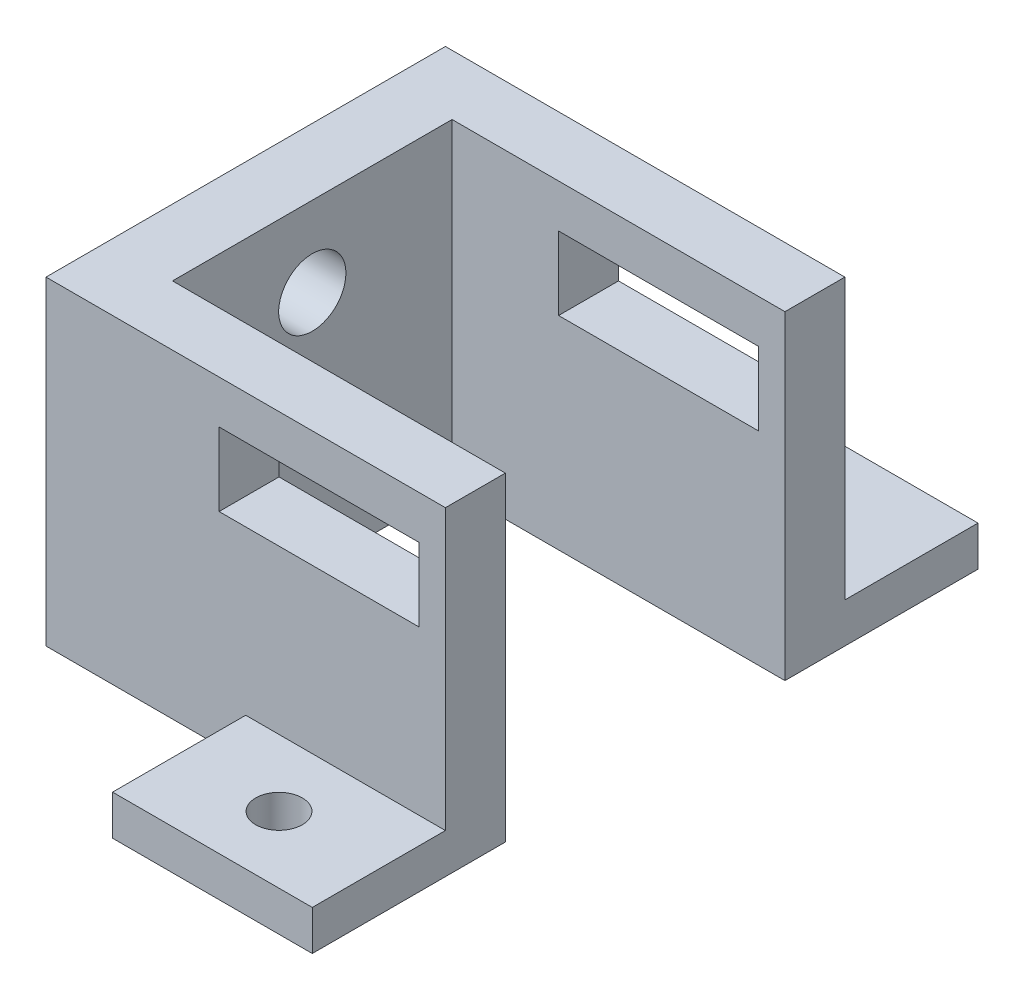
ISO-10303-21;
HEADER;
FILE_DESCRIPTION(('STEP AP214'),'2;1');
FILE_NAME('part.step','',(''),(''),'','','');
FILE_SCHEMA(('AUTOMOTIVE_DESIGN { 1 0 10303 214 1 1 1 1 }'));
ENDSEC;
DATA;
#1=APPLICATION_CONTEXT('core data for automotive mechanical design processes');
#2=APPLICATION_PROTOCOL_DEFINITION('international standard','automotive_design',2000,#1);
#3=PRODUCT_CONTEXT('',#1,'mechanical');
#4=PRODUCT('Part','Part','',(#3));
#5=PRODUCT_RELATED_PRODUCT_CATEGORY('part','',(#4));
#6=PRODUCT_DEFINITION_FORMATION('','',#4);
#7=PRODUCT_DEFINITION_CONTEXT('part definition',#1,'design');
#8=PRODUCT_DEFINITION('design','',#6,#7);
#9=PRODUCT_DEFINITION_SHAPE('','',#8);
#10=(LENGTH_UNIT() NAMED_UNIT(*) SI_UNIT(.MILLI.,.METRE.));
#11=(NAMED_UNIT(*) PLANE_ANGLE_UNIT() SI_UNIT($,.RADIAN.));
#12=(NAMED_UNIT(*) SI_UNIT($,.STERADIAN.) SOLID_ANGLE_UNIT());
#13=UNCERTAINTY_MEASURE_WITH_UNIT(LENGTH_MEASURE(1.E-05),#10,'distance_accuracy_value','');
#14=(GEOMETRIC_REPRESENTATION_CONTEXT(3) GLOBAL_UNCERTAINTY_ASSIGNED_CONTEXT((#13)) GLOBAL_UNIT_ASSIGNED_CONTEXT((#10,
#11,#12)) REPRESENTATION_CONTEXT('',''));
#15=CARTESIAN_POINT('',(0.,0.,0.));
#16=DIRECTION('',(0.,0.,1.));
#17=DIRECTION('',(1.,0.,0.));
#18=AXIS2_PLACEMENT_3D('',#15,#16,#17);
#19=CARTESIAN_POINT('',(0.,0.,30.));
#20=DIRECTION('',(0.,0.,-1.));
#21=DIRECTION('',(-1.,0.,0.));
#22=AXIS2_PLACEMENT_3D('',#19,#20,#21);
#23=PLANE('',#22);
#24=DIRECTION('',(0.,-1.,0.));
#25=VECTOR('',#24,1.);
#26=CARTESIAN_POINT('',(-2.,3.24999999999999,30.));
#27=LINE('',#26,#25);
#28=CARTESIAN_POINT('',(-2.,8.75,30.));
#29=VERTEX_POINT('',#28);
#30=CARTESIAN_POINT('',(-2.,3.24999999999999,30.));
#31=VERTEX_POINT('',#30);
#32=EDGE_CURVE('E303',#29,#31,#27,.T.);
#33=ORIENTED_EDGE('',*,*,#32,.F.);
#34=DIRECTION('',(-1.,0.,0.));
#35=VECTOR('',#34,1.);
#36=CARTESIAN_POINT('',(13.,8.74999999999999,30.));
#37=LINE('',#36,#35);
#38=CARTESIAN_POINT('',(13.,8.74999999999999,30.));
#39=VERTEX_POINT('',#38);
#40=EDGE_CURVE('E311',#39,#29,#37,.T.);
#41=ORIENTED_EDGE('',*,*,#40,.F.);
#42=DIRECTION('',(0.,1.,0.));
#43=VECTOR('',#42,1.);
#44=CARTESIAN_POINT('',(13.,3.25,30.));
#45=LINE('',#44,#43);
#46=CARTESIAN_POINT('',(13.,3.25,30.));
#47=VERTEX_POINT('',#46);
#48=EDGE_CURVE('E308',#47,#39,#45,.T.);
#49=ORIENTED_EDGE('',*,*,#48,.F.);
#50=DIRECTION('',(1.,0.,0.));
#51=VECTOR('',#50,1.);
#52=CARTESIAN_POINT('',(13.,3.25,30.));
#53=LINE('',#52,#51);
#54=EDGE_CURVE('E305',#31,#47,#53,.T.);
#55=ORIENTED_EDGE('',*,*,#54,.F.);
#56=EDGE_LOOP('',(#33,#41,#49,#55));
#57=FACE_BOUND('',#56,.T.);
#58=DIRECTION('',(0.,-1.,0.));
#59=VECTOR('',#58,1.);
#60=CARTESIAN_POINT('',(0.,-12.,30.));
#61=LINE('',#60,#59);
#62=CARTESIAN_POINT('',(0.,-9.,30.));
#63=VERTEX_POINT('',#62);
#64=CARTESIAN_POINT('',(0.,-12.,30.));
#65=VERTEX_POINT('',#64);
#66=EDGE_CURVE('E237',#63,#65,#61,.T.);
#67=ORIENTED_EDGE('',*,*,#66,.F.);
#68=DIRECTION('',(-1.,0.,0.));
#69=VECTOR('',#68,1.);
#70=CARTESIAN_POINT('',(15.,-9.,30.));
#71=LINE('',#70,#69);
#72=CARTESIAN_POINT('',(15.,-9.,30.));
#73=VERTEX_POINT('',#72);
#74=EDGE_CURVE('E232',#73,#63,#71,.T.);
#75=ORIENTED_EDGE('',*,*,#74,.F.);
#76=DIRECTION('',(0.,1.,0.));
#77=VECTOR('',#76,1.);
#78=CARTESIAN_POINT('',(15.,-12.,30.));
#79=LINE('',#78,#77);
#80=CARTESIAN_POINT('',(15.,12.,30.));
#81=VERTEX_POINT('',#80);
#82=EDGE_CURVE('E339',#73,#81,#79,.T.);
#83=ORIENTED_EDGE('',*,*,#82,.T.);
#84=DIRECTION('',(-1.,0.,0.));
#85=VECTOR('',#84,1.);
#86=CARTESIAN_POINT('',(-15.,12.,30.));
#87=LINE('',#86,#85);
#88=CARTESIAN_POINT('',(-15.,12.,30.));
#89=VERTEX_POINT('',#88);
#90=EDGE_CURVE('E341',#81,#89,#87,.T.);
#91=ORIENTED_EDGE('',*,*,#90,.T.);
#92=DIRECTION('',(0.,-1.,0.));
#93=VECTOR('',#92,1.);
#94=CARTESIAN_POINT('',(-15.,-12.,30.));
#95=LINE('',#94,#93);
#96=CARTESIAN_POINT('',(-15.,-12.,30.));
#97=VERTEX_POINT('',#96);
#98=EDGE_CURVE('E344',#89,#97,#95,.T.);
#99=ORIENTED_EDGE('',*,*,#98,.T.);
#100=DIRECTION('',(1.,0.,0.));
#101=VECTOR('',#100,1.);
#102=CARTESIAN_POINT('',(-15.,-12.,30.));
#103=LINE('',#102,#101);
#104=EDGE_CURVE('E199',#97,#65,#103,.T.);
#105=ORIENTED_EDGE('',*,*,#104,.T.);
#106=EDGE_LOOP('',(#67,#75,#83,#91,#99,#105));
#107=FACE_BOUND('',#106,.T.);
#108=ADVANCED_FACE('F39',(#57,#107),#23,.F.);
#109=CARTESIAN_POINT('',(15.,-12.,30.));
#110=DIRECTION('',(-1.,0.,0.));
#111=DIRECTION('',(0.,0.,1.));
#112=AXIS2_PLACEMENT_3D('',#109,#110,#111);
#113=PLANE('',#112);
#114=DIRECTION('',(0.,1.,0.));
#115=VECTOR('',#114,1.);
#116=CARTESIAN_POINT('',(15.,0.,25.5));
#117=LINE('',#116,#115);
#118=CARTESIAN_POINT('',(15.,-12.,25.5));
#119=VERTEX_POINT('',#118);
#120=CARTESIAN_POINT('',(15.,12.,25.5));
#121=VERTEX_POINT('',#120);
#122=EDGE_CURVE('E267',#119,#121,#117,.T.);
#123=ORIENTED_EDGE('',*,*,#122,.T.);
#124=DIRECTION('',(0.,0.,-1.));
#125=VECTOR('',#124,1.);
#126=CARTESIAN_POINT('',(15.,12.,30.));
#127=LINE('',#126,#125);
#128=EDGE_CURVE('E361',#81,#121,#127,.T.);
#129=ORIENTED_EDGE('',*,*,#128,.F.);
#130=ORIENTED_EDGE('',*,*,#82,.F.);
#131=DIRECTION('',(0.,0.,-1.));
#132=VECTOR('',#131,1.);
#133=CARTESIAN_POINT('',(15.,-9.,40.));
#134=LINE('',#133,#132);
#135=CARTESIAN_POINT('',(15.,-9.,40.));
#136=VERTEX_POINT('',#135);
#137=EDGE_CURVE('E254',#136,#73,#134,.T.);
#138=ORIENTED_EDGE('',*,*,#137,.F.);
#139=DIRECTION('',(0.,1.,0.));
#140=VECTOR('',#139,1.);
#141=CARTESIAN_POINT('',(15.,-12.,40.));
#142=LINE('',#141,#140);
#143=CARTESIAN_POINT('',(15.,-12.,40.));
#144=VERTEX_POINT('',#143);
#145=EDGE_CURVE('E233',#144,#136,#142,.T.);
#146=ORIENTED_EDGE('',*,*,#145,.F.);
#147=DIRECTION('',(0.,0.,-1.));
#148=VECTOR('',#147,1.);
#149=CARTESIAN_POINT('',(15.,-12.,30.));
#150=LINE('',#149,#148);
#151=EDGE_CURVE('E198',#144,#119,#150,.T.);
#152=ORIENTED_EDGE('',*,*,#151,.T.);
#153=EDGE_LOOP('',(#123,#129,#130,#138,#146,#152));
#154=FACE_BOUND('',#153,.T.);
#155=ADVANCED_FACE('F404',(#154),#113,.F.);
#156=CARTESIAN_POINT('',(-15.,12.,30.));
#157=DIRECTION('',(0.,-1.,0.));
#158=DIRECTION('',(0.,0.,-1.));
#159=AXIS2_PLACEMENT_3D('',#156,#157,#158);
#160=PLANE('',#159);
#161=DIRECTION('',(1.,0.,0.));
#162=VECTOR('',#161,1.);
#163=CARTESIAN_POINT('',(-10.,12.,25.5));
#164=LINE('',#163,#162);
#165=CARTESIAN_POINT('',(-10.,12.,25.5));
#166=VERTEX_POINT('',#165);
#167=EDGE_CURVE('E282',#166,#121,#164,.T.);
#168=ORIENTED_EDGE('',*,*,#167,.F.);
#169=DIRECTION('',(0.,0.,1.));
#170=VECTOR('',#169,1.);
#171=CARTESIAN_POINT('',(-10.,12.,0.));
#172=LINE('',#171,#170);
#173=CARTESIAN_POINT('',(-10.,12.,4.5));
#174=VERTEX_POINT('',#173);
#175=EDGE_CURVE('E270',#174,#166,#172,.T.);
#176=ORIENTED_EDGE('',*,*,#175,.F.);
#177=DIRECTION('',(1.,0.,0.));
#178=VECTOR('',#177,1.);
#179=CARTESIAN_POINT('',(-10.,12.,4.5));
#180=LINE('',#179,#178);
#181=CARTESIAN_POINT('',(15.,12.,4.5));
#182=VERTEX_POINT('',#181);
#183=EDGE_CURVE('E284',#174,#182,#180,.T.);
#184=ORIENTED_EDGE('',*,*,#183,.T.);
#185=CARTESIAN_POINT('',(15.,12.,0.));
#186=VERTEX_POINT('',#185);
#187=EDGE_CURVE('E360',#182,#186,#127,.T.);
#188=ORIENTED_EDGE('',*,*,#187,.T.);
#189=DIRECTION('',(-1.,0.,0.));
#190=VECTOR('',#189,1.);
#191=CARTESIAN_POINT('',(-15.,12.,0.));
#192=LINE('',#191,#190);
#193=CARTESIAN_POINT('',(-15.,12.,0.));
#194=VERTEX_POINT('',#193);
#195=EDGE_CURVE('E348',#186,#194,#192,.T.);
#196=ORIENTED_EDGE('',*,*,#195,.T.);
#197=DIRECTION('',(0.,0.,-1.));
#198=VECTOR('',#197,1.);
#199=CARTESIAN_POINT('',(-15.,12.,30.));
#200=LINE('',#199,#198);
#201=EDGE_CURVE('E357',#89,#194,#200,.T.);
#202=ORIENTED_EDGE('',*,*,#201,.F.);
#203=ORIENTED_EDGE('',*,*,#90,.F.);
#204=ORIENTED_EDGE('',*,*,#128,.T.);
#205=EDGE_LOOP('',(#168,#176,#184,#188,#196,#202,#203,#204));
#206=FACE_BOUND('',#205,.T.);
#207=ADVANCED_FACE('F409',(#206),#160,.F.);
#208=CARTESIAN_POINT('',(-15.,-12.,30.));
#209=DIRECTION('',(0.,1.,0.));
#210=DIRECTION('',(0.,0.,1.));
#211=AXIS2_PLACEMENT_3D('',#208,#209,#210);
#212=PLANE('',#211);
#213=CARTESIAN_POINT('',(7.5,-12.,-5.));
#214=DIRECTION('',(0.,1.,0.));
#215=DIRECTION('',(0.,0.,1.));
#216=AXIS2_PLACEMENT_3D('',#213,#214,#215);
#217=CIRCLE('',#216,1.75);
#218=CARTESIAN_POINT('',(7.5,-12.,-3.25));
#219=VERTEX_POINT('',#218);
#220=EDGE_CURVE('E758',#219,#219,#217,.T.);
#221=ORIENTED_EDGE('',*,*,#220,.T.);
#222=EDGE_LOOP('',(#221));
#223=FACE_BOUND('',#222,.T.);
#224=CARTESIAN_POINT('',(7.5,-12.,35.));
#225=DIRECTION('',(0.,1.,0.));
#226=DIRECTION('',(0.,0.,1.));
#227=AXIS2_PLACEMENT_3D('',#224,#225,#226);
#228=CIRCLE('',#227,1.75);
#229=CARTESIAN_POINT('',(7.5,-12.,36.75));
#230=VERTEX_POINT('',#229);
#231=EDGE_CURVE('E225',#230,#230,#228,.T.);
#232=ORIENTED_EDGE('',*,*,#231,.T.);
#233=EDGE_LOOP('',(#232));
#234=FACE_BOUND('',#233,.T.);
#235=DIRECTION('',(1.,0.,0.));
#236=VECTOR('',#235,1.);
#237=CARTESIAN_POINT('',(-10.,-12.,25.5));
#238=LINE('',#237,#236);
#239=CARTESIAN_POINT('',(-10.,-12.,25.5));
#240=VERTEX_POINT('',#239);
#241=EDGE_CURVE('E279',#240,#119,#238,.T.);
#242=ORIENTED_EDGE('',*,*,#241,.T.);
#243=ORIENTED_EDGE('',*,*,#151,.F.);
#244=DIRECTION('',(1.,0.,0.));
#245=VECTOR('',#244,1.);
#246=CARTESIAN_POINT('',(15.,-12.,40.));
#247=LINE('',#246,#245);
#248=CARTESIAN_POINT('',(0.,-12.,40.));
#249=VERTEX_POINT('',#248);
#250=EDGE_CURVE('E241',#249,#144,#247,.T.);
#251=ORIENTED_EDGE('',*,*,#250,.F.);
#252=DIRECTION('',(0.,0.,-1.));
#253=VECTOR('',#252,1.);
#254=CARTESIAN_POINT('',(0.,-12.,40.));
#255=LINE('',#254,#253);
#256=EDGE_CURVE('E244',#249,#65,#255,.T.);
#257=ORIENTED_EDGE('',*,*,#256,.T.);
#258=ORIENTED_EDGE('',*,*,#104,.F.);
#259=DIRECTION('',(0.,0.,-1.));
#260=VECTOR('',#259,1.);
#261=CARTESIAN_POINT('',(-15.,-12.,30.));
#262=LINE('',#261,#260);
#263=CARTESIAN_POINT('',(-15.,-12.,0.));
#264=VERTEX_POINT('',#263);
#265=EDGE_CURVE('E354',#97,#264,#262,.T.);
#266=ORIENTED_EDGE('',*,*,#265,.T.);
#267=DIRECTION('',(1.,0.,0.));
#268=VECTOR('',#267,1.);
#269=CARTESIAN_POINT('',(-15.,-12.,0.));
#270=LINE('',#269,#268);
#271=CARTESIAN_POINT('',(0.,-12.,0.));
#272=VERTEX_POINT('',#271);
#273=EDGE_CURVE('E342',#264,#272,#270,.T.);
#274=ORIENTED_EDGE('',*,*,#273,.T.);
#275=DIRECTION('',(0.,0.,1.));
#276=VECTOR('',#275,1.);
#277=CARTESIAN_POINT('',(0.,-12.,-10.));
#278=LINE('',#277,#276);
#279=CARTESIAN_POINT('',(0.,-12.,-10.));
#280=VERTEX_POINT('',#279);
#281=EDGE_CURVE('E206',#280,#272,#278,.T.);
#282=ORIENTED_EDGE('',*,*,#281,.F.);
#283=DIRECTION('',(-1.,0.,0.));
#284=VECTOR('',#283,1.);
#285=CARTESIAN_POINT('',(15.,-12.,-10.));
#286=LINE('',#285,#284);
#287=CARTESIAN_POINT('',(15.,-12.,-10.));
#288=VERTEX_POINT('',#287);
#289=EDGE_CURVE('E202',#288,#280,#286,.T.);
#290=ORIENTED_EDGE('',*,*,#289,.F.);
#291=CARTESIAN_POINT('',(15.,-12.,4.5));
#292=VERTEX_POINT('',#291);
#293=EDGE_CURVE('E189',#292,#288,#150,.T.);
#294=ORIENTED_EDGE('',*,*,#293,.F.);
#295=DIRECTION('',(1.,0.,0.));
#296=VECTOR('',#295,1.);
#297=CARTESIAN_POINT('',(-10.,-12.,4.5));
#298=LINE('',#297,#296);
#299=CARTESIAN_POINT('',(-10.,-12.,4.5));
#300=VERTEX_POINT('',#299);
#301=EDGE_CURVE('E275',#300,#292,#298,.T.);
#302=ORIENTED_EDGE('',*,*,#301,.F.);
#303=DIRECTION('',(0.,0.,-1.));
#304=VECTOR('',#303,1.);
#305=CARTESIAN_POINT('',(-10.,-12.,0.));
#306=LINE('',#305,#304);
#307=EDGE_CURVE('E263',#240,#300,#306,.T.);
#308=ORIENTED_EDGE('',*,*,#307,.F.);
#309=EDGE_LOOP('',(#242,#243,#251,#257,#258,#266,#274,#282,#290,#294,#302,#308));
#310=FACE_BOUND('',#309,.T.);
#311=ADVANCED_FACE('F204',(#223,#234,#310),#212,.F.);
#312=CARTESIAN_POINT('',(-2.,3.24999999999999,30.));
#313=DIRECTION('',(1.,0.,0.));
#314=DIRECTION('',(0.,1.,0.));
#315=AXIS2_PLACEMENT_3D('',#312,#313,#314);
#316=PLANE('',#315);
#317=DIRECTION('',(0.,0.,-1.));
#318=VECTOR('',#317,1.);
#319=CARTESIAN_POINT('',(-2.,3.24999999999999,30.));
#320=LINE('',#319,#318);
#321=CARTESIAN_POINT('',(-2.,3.24999999999999,25.5));
#322=VERTEX_POINT('',#321);
#323=EDGE_CURVE('E336',#31,#322,#320,.T.);
#324=ORIENTED_EDGE('',*,*,#323,.T.);
#325=DIRECTION('',(0.,1.,0.));
#326=VECTOR('',#325,1.);
#327=CARTESIAN_POINT('',(-2.,3.24999999999999,25.5));
#328=LINE('',#327,#326);
#329=CARTESIAN_POINT('',(-2.,8.75,25.5));
#330=VERTEX_POINT('',#329);
#331=EDGE_CURVE('E299',#322,#330,#328,.T.);
#332=ORIENTED_EDGE('',*,*,#331,.T.);
#333=DIRECTION('',(0.,0.,-1.));
#334=VECTOR('',#333,1.);
#335=CARTESIAN_POINT('',(-2.,8.75,30.));
#336=LINE('',#335,#334);
#337=EDGE_CURVE('E324',#29,#330,#336,.T.);
#338=ORIENTED_EDGE('',*,*,#337,.F.);
#339=ORIENTED_EDGE('',*,*,#32,.T.);
#340=EDGE_LOOP('',(#324,#332,#338,#339));
#341=FACE_BOUND('',#340,.T.);
#342=ADVANCED_FACE('F391',(#341),#316,.T.);
#343=CARTESIAN_POINT('',(13.,3.25,30.));
#344=DIRECTION('',(0.,1.,0.));
#345=DIRECTION('',(-1.,0.,0.));
#346=AXIS2_PLACEMENT_3D('',#343,#344,#345);
#347=PLANE('',#346);
#348=DIRECTION('',(0.,0.,-1.));
#349=VECTOR('',#348,1.);
#350=CARTESIAN_POINT('',(13.,3.25,30.));
#351=LINE('',#350,#349);
#352=CARTESIAN_POINT('',(13.,3.25,25.5));
#353=VERTEX_POINT('',#352);
#354=EDGE_CURVE('E332',#47,#353,#351,.T.);
#355=ORIENTED_EDGE('',*,*,#354,.T.);
#356=DIRECTION('',(-1.,0.,0.));
#357=VECTOR('',#356,1.);
#358=CARTESIAN_POINT('',(13.,3.25,25.5));
#359=LINE('',#358,#357);
#360=EDGE_CURVE('E296',#353,#322,#359,.T.);
#361=ORIENTED_EDGE('',*,*,#360,.T.);
#362=ORIENTED_EDGE('',*,*,#323,.F.);
#363=ORIENTED_EDGE('',*,*,#54,.T.);
#364=EDGE_LOOP('',(#355,#361,#362,#363));
#365=FACE_BOUND('',#364,.T.);
#366=ADVANCED_FACE('F397',(#365),#347,.T.);
#367=CARTESIAN_POINT('',(13.,3.25,30.));
#368=DIRECTION('',(-1.,0.,0.));
#369=DIRECTION('',(0.,0.,1.));
#370=AXIS2_PLACEMENT_3D('',#367,#368,#369);
#371=PLANE('',#370);
#372=DIRECTION('',(0.,0.,-1.));
#373=VECTOR('',#372,1.);
#374=CARTESIAN_POINT('',(13.,8.74999999999999,30.));
#375=LINE('',#374,#373);
#376=CARTESIAN_POINT('',(13.,8.74999999999999,25.5));
#377=VERTEX_POINT('',#376);
#378=EDGE_CURVE('E328',#39,#377,#375,.T.);
#379=ORIENTED_EDGE('',*,*,#378,.T.);
#380=DIRECTION('',(0.,-1.,0.));
#381=VECTOR('',#380,1.);
#382=CARTESIAN_POINT('',(13.,3.24999999999999,25.5));
#383=LINE('',#382,#381);
#384=EDGE_CURVE('E293',#377,#353,#383,.T.);
#385=ORIENTED_EDGE('',*,*,#384,.T.);
#386=ORIENTED_EDGE('',*,*,#354,.F.);
#387=ORIENTED_EDGE('',*,*,#48,.T.);
#388=EDGE_LOOP('',(#379,#385,#386,#387));
#389=FACE_BOUND('',#388,.T.);
#390=ADVANCED_FACE('F477',(#389),#371,.T.);
#391=CARTESIAN_POINT('',(13.,8.74999999999999,30.));
#392=DIRECTION('',(0.,-1.,0.));
#393=DIRECTION('',(1.,0.,0.));
#394=AXIS2_PLACEMENT_3D('',#391,#392,#393);
#395=PLANE('',#394);
#396=ORIENTED_EDGE('',*,*,#337,.T.);
#397=DIRECTION('',(1.,0.,0.));
#398=VECTOR('',#397,1.);
#399=CARTESIAN_POINT('',(13.,8.74999999999999,25.5));
#400=LINE('',#399,#398);
#401=EDGE_CURVE('E11',#330,#377,#400,.T.);
#402=ORIENTED_EDGE('',*,*,#401,.T.);
#403=ORIENTED_EDGE('',*,*,#378,.F.);
#404=ORIENTED_EDGE('',*,*,#40,.T.);
#405=EDGE_LOOP('',(#396,#402,#403,#404));
#406=FACE_BOUND('',#405,.T.);
#407=ADVANCED_FACE('F416',(#406),#395,.T.);
#408=CARTESIAN_POINT('',(0.,0.,0.));
#409=DIRECTION('',(0.,0.,-1.));
#410=DIRECTION('',(-1.,0.,0.));
#411=AXIS2_PLACEMENT_3D('',#408,#409,#410);
#412=PLANE('',#411);
#413=DIRECTION('',(1.,0.,0.));
#414=VECTOR('',#413,1.);
#415=CARTESIAN_POINT('',(15.,-9.,0.));
#416=LINE('',#415,#414);
#417=CARTESIAN_POINT('',(0.,-9.,0.));
#418=VERTEX_POINT('',#417);
#419=CARTESIAN_POINT('',(15.,-9.,0.));
#420=VERTEX_POINT('',#419);
#421=EDGE_CURVE('E215',#418,#420,#416,.T.);
#422=ORIENTED_EDGE('',*,*,#421,.F.);
#423=DIRECTION('',(0.,1.,0.));
#424=VECTOR('',#423,1.);
#425=CARTESIAN_POINT('',(0.,-12.,0.));
#426=LINE('',#425,#424);
#427=EDGE_CURVE('E54',#272,#418,#426,.T.);
#428=ORIENTED_EDGE('',*,*,#427,.F.);
#429=ORIENTED_EDGE('',*,*,#273,.F.);
#430=DIRECTION('',(0.,-1.,0.));
#431=VECTOR('',#430,1.);
#432=CARTESIAN_POINT('',(-15.,-12.,0.));
#433=LINE('',#432,#431);
#434=EDGE_CURVE('E350',#194,#264,#433,.T.);
#435=ORIENTED_EDGE('',*,*,#434,.F.);
#436=ORIENTED_EDGE('',*,*,#195,.F.);
#437=DIRECTION('',(0.,1.,0.));
#438=VECTOR('',#437,1.);
#439=CARTESIAN_POINT('',(15.,-12.,0.));
#440=LINE('',#439,#438);
#441=EDGE_CURVE('E60',#420,#186,#440,.T.);
#442=ORIENTED_EDGE('',*,*,#441,.F.);
#443=EDGE_LOOP('',(#422,#428,#429,#435,#436,#442));
#444=FACE_BOUND('',#443,.T.);
#445=DIRECTION('',(-1.,0.,0.));
#446=VECTOR('',#445,1.);
#447=CARTESIAN_POINT('',(13.,8.74999999999999,0.));
#448=LINE('',#447,#446);
#449=CARTESIAN_POINT('',(13.,8.74999999999999,0.));
#450=VERTEX_POINT('',#449);
#451=CARTESIAN_POINT('',(-2.,8.75,0.));
#452=VERTEX_POINT('',#451);
#453=EDGE_CURVE('E306',#450,#452,#448,.T.);
#454=ORIENTED_EDGE('',*,*,#453,.T.);
#455=DIRECTION('',(0.,-1.,0.));
#456=VECTOR('',#455,1.);
#457=CARTESIAN_POINT('',(-2.,3.24999999999999,0.));
#458=LINE('',#457,#456);
#459=CARTESIAN_POINT('',(-2.,3.24999999999999,0.));
#460=VERTEX_POINT('',#459);
#461=EDGE_CURVE('E302',#452,#460,#458,.T.);
#462=ORIENTED_EDGE('',*,*,#461,.T.);
#463=DIRECTION('',(1.,0.,0.));
#464=VECTOR('',#463,1.);
#465=CARTESIAN_POINT('',(13.,3.25,0.));
#466=LINE('',#465,#464);
#467=CARTESIAN_POINT('',(13.,3.25,0.));
#468=VERTEX_POINT('',#467);
#469=EDGE_CURVE('E316',#460,#468,#466,.T.);
#470=ORIENTED_EDGE('',*,*,#469,.T.);
#471=DIRECTION('',(0.,1.,0.));
#472=VECTOR('',#471,1.);
#473=CARTESIAN_POINT('',(13.,3.25,0.));
#474=LINE('',#473,#472);
#475=EDGE_CURVE('E319',#468,#450,#474,.T.);
#476=ORIENTED_EDGE('',*,*,#475,.T.);
#477=EDGE_LOOP('',(#454,#462,#470,#476));
#478=FACE_BOUND('',#477,.T.);
#479=ADVANCED_FACE('F381',(#444,#478),#412,.T.);
#480=ORIENTED_EDGE('',*,*,#187,.F.);
#481=DIRECTION('',(0.,1.,0.));
#482=VECTOR('',#481,1.);
#483=CARTESIAN_POINT('',(15.,0.,4.5));
#484=LINE('',#483,#482);
#485=EDGE_CURVE('E195',#292,#182,#484,.T.);
#486=ORIENTED_EDGE('',*,*,#485,.F.);
#487=ORIENTED_EDGE('',*,*,#293,.T.);
#488=DIRECTION('',(0.,-1.,0.));
#489=VECTOR('',#488,1.);
#490=CARTESIAN_POINT('',(15.,-12.,-10.));
#491=LINE('',#490,#489);
#492=CARTESIAN_POINT('',(15.,-9.,-10.));
#493=VERTEX_POINT('',#492);
#494=EDGE_CURVE('E194',#493,#288,#491,.T.);
#495=ORIENTED_EDGE('',*,*,#494,.F.);
#496=DIRECTION('',(0.,0.,1.));
#497=VECTOR('',#496,1.);
#498=CARTESIAN_POINT('',(15.,-9.,-10.));
#499=LINE('',#498,#497);
#500=EDGE_CURVE('E224',#493,#420,#499,.T.);
#501=ORIENTED_EDGE('',*,*,#500,.T.);
#502=ORIENTED_EDGE('',*,*,#441,.T.);
#503=EDGE_LOOP('',(#480,#486,#487,#495,#501,#502));
#504=FACE_BOUND('',#503,.T.);
#505=ADVANCED_FACE('F41',(#504),#113,.F.);
#506=CARTESIAN_POINT('',(-15.,-12.,30.));
#507=DIRECTION('',(1.,0.,0.));
#508=DIRECTION('',(0.,0.,-1.));
#509=AXIS2_PLACEMENT_3D('',#506,#507,#508);
#510=PLANE('',#509);
#511=CARTESIAN_POINT('',(-15.,6.,15.));
#512=DIRECTION('',(1.,0.,0.));
#513=DIRECTION('',(0.,0.,-1.));
#514=AXIS2_PLACEMENT_3D('',#511,#512,#513);
#515=CIRCLE('',#514,2.525);
#516=CARTESIAN_POINT('',(-15.,6.,12.475));
#517=VERTEX_POINT('',#516);
#518=EDGE_CURVE('E258',#517,#517,#515,.T.);
#519=ORIENTED_EDGE('',*,*,#518,.T.);
#520=EDGE_LOOP('',(#519));
#521=FACE_BOUND('',#520,.T.);
#522=ORIENTED_EDGE('',*,*,#434,.T.);
#523=ORIENTED_EDGE('',*,*,#265,.F.);
#524=ORIENTED_EDGE('',*,*,#98,.F.);
#525=ORIENTED_EDGE('',*,*,#201,.T.);
#526=EDGE_LOOP('',(#522,#523,#524,#525));
#527=FACE_BOUND('',#526,.T.);
#528=ADVANCED_FACE('F389',(#521,#527),#510,.F.);
#529=DIRECTION('',(0.,1.,0.));
#530=VECTOR('',#529,1.);
#531=CARTESIAN_POINT('',(-2.,3.24999999999999,4.5));
#532=LINE('',#531,#530);
#533=CARTESIAN_POINT('',(-2.,3.24999999999999,4.5));
#534=VERTEX_POINT('',#533);
#535=CARTESIAN_POINT('',(-2.,8.75,4.5));
#536=VERTEX_POINT('',#535);
#537=EDGE_CURVE('E291',#534,#536,#532,.T.);
#538=ORIENTED_EDGE('',*,*,#537,.F.);
#539=EDGE_CURVE('E335',#534,#460,#320,.T.);
#540=ORIENTED_EDGE('',*,*,#539,.T.);
#541=ORIENTED_EDGE('',*,*,#461,.F.);
#542=EDGE_CURVE('E313',#536,#452,#336,.T.);
#543=ORIENTED_EDGE('',*,*,#542,.F.);
#544=EDGE_LOOP('',(#538,#540,#541,#543));
#545=FACE_BOUND('',#544,.T.);
#546=ADVANCED_FACE('F387',(#545),#316,.T.);
#547=DIRECTION('',(-1.,0.,0.));
#548=VECTOR('',#547,1.);
#549=CARTESIAN_POINT('',(13.,3.25,4.5));
#550=LINE('',#549,#548);
#551=CARTESIAN_POINT('',(13.,3.25,4.5));
#552=VERTEX_POINT('',#551);
#553=EDGE_CURVE('E289',#552,#534,#550,.T.);
#554=ORIENTED_EDGE('',*,*,#553,.F.);
#555=EDGE_CURVE('E331',#552,#468,#351,.T.);
#556=ORIENTED_EDGE('',*,*,#555,.T.);
#557=ORIENTED_EDGE('',*,*,#469,.F.);
#558=ORIENTED_EDGE('',*,*,#539,.F.);
#559=EDGE_LOOP('',(#554,#556,#557,#558));
#560=FACE_BOUND('',#559,.T.);
#561=ADVANCED_FACE('F385',(#560),#347,.T.);
#562=DIRECTION('',(0.,-1.,0.));
#563=VECTOR('',#562,1.);
#564=CARTESIAN_POINT('',(13.,3.25,4.5));
#565=LINE('',#564,#563);
#566=CARTESIAN_POINT('',(13.,8.74999999999999,4.5));
#567=VERTEX_POINT('',#566);
#568=EDGE_CURVE('E281',#567,#552,#565,.T.);
#569=ORIENTED_EDGE('',*,*,#568,.F.);
#570=EDGE_CURVE('E327',#567,#450,#375,.T.);
#571=ORIENTED_EDGE('',*,*,#570,.T.);
#572=ORIENTED_EDGE('',*,*,#475,.F.);
#573=ORIENTED_EDGE('',*,*,#555,.F.);
#574=EDGE_LOOP('',(#569,#571,#572,#573));
#575=FACE_BOUND('',#574,.T.);
#576=ADVANCED_FACE('F375',(#575),#371,.T.);
#577=DIRECTION('',(1.,0.,0.));
#578=VECTOR('',#577,1.);
#579=CARTESIAN_POINT('',(13.,8.74999999999999,4.5));
#580=LINE('',#579,#578);
#581=EDGE_CURVE('E47',#536,#567,#580,.T.);
#582=ORIENTED_EDGE('',*,*,#581,.F.);
#583=ORIENTED_EDGE('',*,*,#542,.T.);
#584=ORIENTED_EDGE('',*,*,#453,.F.);
#585=ORIENTED_EDGE('',*,*,#570,.F.);
#586=EDGE_LOOP('',(#582,#583,#584,#585));
#587=FACE_BOUND('',#586,.T.);
#588=ADVANCED_FACE('F378',(#587),#395,.T.);
#589=CARTESIAN_POINT('',(-10.,0.,25.5));
#590=DIRECTION('',(0.,0.,-1.));
#591=DIRECTION('',(0.,1.,0.));
#592=AXIS2_PLACEMENT_3D('',#589,#590,#591);
#593=PLANE('',#592);
#594=ORIENTED_EDGE('',*,*,#360,.F.);
#595=ORIENTED_EDGE('',*,*,#384,.F.);
#596=ORIENTED_EDGE('',*,*,#401,.F.);
#597=ORIENTED_EDGE('',*,*,#331,.F.);
#598=EDGE_LOOP('',(#594,#595,#596,#597));
#599=FACE_BOUND('',#598,.T.);
#600=ORIENTED_EDGE('',*,*,#122,.F.);
#601=ORIENTED_EDGE('',*,*,#241,.F.);
#602=DIRECTION('',(0.,1.,0.));
#603=VECTOR('',#602,1.);
#604=CARTESIAN_POINT('',(-10.,0.,25.5));
#605=LINE('',#604,#603);
#606=EDGE_CURVE('E273',#240,#166,#605,.T.);
#607=ORIENTED_EDGE('',*,*,#606,.T.);
#608=ORIENTED_EDGE('',*,*,#167,.T.);
#609=EDGE_LOOP('',(#600,#601,#607,#608));
#610=FACE_BOUND('',#609,.T.);
#611=ADVANCED_FACE('F428',(#599,#610),#593,.T.);
#612=CARTESIAN_POINT('',(-10.,0.,4.5));
#613=DIRECTION('',(0.,0.,-1.));
#614=DIRECTION('',(-1.,0.,0.));
#615=AXIS2_PLACEMENT_3D('',#612,#613,#614);
#616=PLANE('',#615);
#617=ORIENTED_EDGE('',*,*,#537,.T.);
#618=ORIENTED_EDGE('',*,*,#581,.T.);
#619=ORIENTED_EDGE('',*,*,#568,.T.);
#620=ORIENTED_EDGE('',*,*,#553,.T.);
#621=EDGE_LOOP('',(#617,#618,#619,#620));
#622=FACE_BOUND('',#621,.T.);
#623=ORIENTED_EDGE('',*,*,#485,.T.);
#624=ORIENTED_EDGE('',*,*,#183,.F.);
#625=DIRECTION('',(0.,1.,0.));
#626=VECTOR('',#625,1.);
#627=CARTESIAN_POINT('',(-10.,0.,4.5));
#628=LINE('',#627,#626);
#629=EDGE_CURVE('E266',#300,#174,#628,.T.);
#630=ORIENTED_EDGE('',*,*,#629,.F.);
#631=ORIENTED_EDGE('',*,*,#301,.T.);
#632=EDGE_LOOP('',(#623,#624,#630,#631));
#633=FACE_BOUND('',#632,.T.);
#634=ADVANCED_FACE('F366',(#622,#633),#616,.F.);
#635=CARTESIAN_POINT('',(-10.,0.,0.));
#636=DIRECTION('',(1.,0.,0.));
#637=DIRECTION('',(0.,0.,-1.));
#638=AXIS2_PLACEMENT_3D('',#635,#636,#637);
#639=PLANE('',#638);
#640=CARTESIAN_POINT('',(-10.,6.,15.));
#641=DIRECTION('',(1.,0.,0.));
#642=DIRECTION('',(0.,0.,-1.));
#643=AXIS2_PLACEMENT_3D('',#640,#641,#642);
#644=CIRCLE('',#643,2.525);
#645=CARTESIAN_POINT('',(-10.,6.,12.475));
#646=VERTEX_POINT('',#645);
#647=EDGE_CURVE('E257',#646,#646,#644,.T.);
#648=ORIENTED_EDGE('',*,*,#647,.F.);
#649=EDGE_LOOP('',(#648));
#650=FACE_BOUND('',#649,.T.);
#651=ORIENTED_EDGE('',*,*,#307,.T.);
#652=ORIENTED_EDGE('',*,*,#629,.T.);
#653=ORIENTED_EDGE('',*,*,#175,.T.);
#654=ORIENTED_EDGE('',*,*,#606,.F.);
#655=EDGE_LOOP('',(#651,#652,#653,#654));
#656=FACE_BOUND('',#655,.T.);
#657=ADVANCED_FACE('F455',(#650,#656),#639,.T.);
#658=CARTESIAN_POINT('',(-15.,6.,15.));
#659=DIRECTION('',(1.,0.,0.));
#660=DIRECTION('',(0.,0.,-1.));
#661=AXIS2_PLACEMENT_3D('',#658,#659,#660);
#662=CYLINDRICAL_SURFACE('',#661,2.525);
#663=ORIENTED_EDGE('',*,*,#518,.F.);
#664=EDGE_LOOP('',(#663));
#665=FACE_BOUND('',#664,.T.);
#666=ORIENTED_EDGE('',*,*,#647,.T.);
#667=EDGE_LOOP('',(#666));
#668=FACE_BOUND('',#667,.T.);
#669=ADVANCED_FACE('F457',(#665,#668),#662,.F.);
#670=CARTESIAN_POINT('',(15.,-9.,40.));
#671=DIRECTION('',(0.,-1.,0.));
#672=DIRECTION('',(0.,0.,-1.));
#673=AXIS2_PLACEMENT_3D('',#670,#671,#672);
#674=PLANE('',#673);
#675=CARTESIAN_POINT('',(7.5,-9.,35.));
#676=DIRECTION('',(0.,1.,0.));
#677=DIRECTION('',(0.,0.,1.));
#678=AXIS2_PLACEMENT_3D('',#675,#676,#677);
#679=CIRCLE('',#678,1.75);
#680=CARTESIAN_POINT('',(7.5,-9.,36.75));
#681=VERTEX_POINT('',#680);
#682=EDGE_CURVE('E219',#681,#681,#679,.T.);
#683=ORIENTED_EDGE('',*,*,#682,.F.);
#684=EDGE_LOOP('',(#683));
#685=FACE_BOUND('',#684,.T.);
#686=ORIENTED_EDGE('',*,*,#74,.T.);
#687=DIRECTION('',(0.,0.,-1.));
#688=VECTOR('',#687,1.);
#689=CARTESIAN_POINT('',(0.,-9.,40.));
#690=LINE('',#689,#688);
#691=CARTESIAN_POINT('',(0.,-9.,40.));
#692=VERTEX_POINT('',#691);
#693=EDGE_CURVE('E251',#692,#63,#690,.T.);
#694=ORIENTED_EDGE('',*,*,#693,.F.);
#695=DIRECTION('',(-1.,0.,0.));
#696=VECTOR('',#695,1.);
#697=CARTESIAN_POINT('',(15.,-9.,40.));
#698=LINE('',#697,#696);
#699=EDGE_CURVE('E236',#136,#692,#698,.T.);
#700=ORIENTED_EDGE('',*,*,#699,.F.);
#701=ORIENTED_EDGE('',*,*,#137,.T.);
#702=EDGE_LOOP('',(#686,#694,#700,#701));
#703=FACE_BOUND('',#702,.T.);
#704=ADVANCED_FACE('F464',(#685,#703),#674,.F.);
#705=CARTESIAN_POINT('',(0.,-12.,40.));
#706=DIRECTION('',(1.,0.,0.));
#707=DIRECTION('',(0.,0.,-1.));
#708=AXIS2_PLACEMENT_3D('',#705,#706,#707);
#709=PLANE('',#708);
#710=ORIENTED_EDGE('',*,*,#66,.T.);
#711=ORIENTED_EDGE('',*,*,#256,.F.);
#712=DIRECTION('',(0.,-1.,0.));
#713=VECTOR('',#712,1.);
#714=CARTESIAN_POINT('',(0.,-12.,40.));
#715=LINE('',#714,#713);
#716=EDGE_CURVE('E239',#692,#249,#715,.T.);
#717=ORIENTED_EDGE('',*,*,#716,.F.);
#718=ORIENTED_EDGE('',*,*,#693,.T.);
#719=EDGE_LOOP('',(#710,#711,#717,#718));
#720=FACE_BOUND('',#719,.T.);
#721=ADVANCED_FACE('F441',(#720),#709,.F.);
#722=CARTESIAN_POINT('',(0.,0.,40.));
#723=DIRECTION('',(0.,0.,1.));
#724=DIRECTION('',(1.,0.,0.));
#725=AXIS2_PLACEMENT_3D('',#722,#723,#724);
#726=PLANE('',#725);
#727=ORIENTED_EDGE('',*,*,#145,.T.);
#728=ORIENTED_EDGE('',*,*,#699,.T.);
#729=ORIENTED_EDGE('',*,*,#716,.T.);
#730=ORIENTED_EDGE('',*,*,#250,.T.);
#731=EDGE_LOOP('',(#727,#728,#729,#730));
#732=FACE_BOUND('',#731,.T.);
#733=ADVANCED_FACE('F436',(#732),#726,.T.);
#734=CARTESIAN_POINT('',(0.,-12.,-10.));
#735=DIRECTION('',(1.,0.,0.));
#736=DIRECTION('',(0.,0.,-1.));
#737=AXIS2_PLACEMENT_3D('',#734,#735,#736);
#738=PLANE('',#737);
#739=ORIENTED_EDGE('',*,*,#427,.T.);
#740=DIRECTION('',(0.,0.,1.));
#741=VECTOR('',#740,1.);
#742=CARTESIAN_POINT('',(0.,-9.,-10.));
#743=LINE('',#742,#741);
#744=CARTESIAN_POINT('',(0.,-9.,-10.));
#745=VERTEX_POINT('',#744);
#746=EDGE_CURVE('E228',#745,#418,#743,.T.);
#747=ORIENTED_EDGE('',*,*,#746,.F.);
#748=DIRECTION('',(0.,1.,0.));
#749=VECTOR('',#748,1.);
#750=CARTESIAN_POINT('',(0.,-12.,-10.));
#751=LINE('',#750,#749);
#752=EDGE_CURVE('E209',#280,#745,#751,.T.);
#753=ORIENTED_EDGE('',*,*,#752,.F.);
#754=ORIENTED_EDGE('',*,*,#281,.T.);
#755=EDGE_LOOP('',(#739,#747,#753,#754));
#756=FACE_BOUND('',#755,.T.);
#757=ADVANCED_FACE('F449',(#756),#738,.F.);
#758=CARTESIAN_POINT('',(15.,-9.,-10.));
#759=DIRECTION('',(0.,-1.,0.));
#760=DIRECTION('',(0.,0.,-1.));
#761=AXIS2_PLACEMENT_3D('',#758,#759,#760);
#762=PLANE('',#761);
#763=CARTESIAN_POINT('',(7.5,-9.,-5.));
#764=DIRECTION('',(0.,1.,0.));
#765=DIRECTION('',(0.,0.,1.));
#766=AXIS2_PLACEMENT_3D('',#763,#764,#765);
#767=CIRCLE('',#766,1.75);
#768=CARTESIAN_POINT('',(7.5,-9.,-3.25));
#769=VERTEX_POINT('',#768);
#770=EDGE_CURVE('E756',#769,#769,#767,.T.);
#771=ORIENTED_EDGE('',*,*,#770,.F.);
#772=EDGE_LOOP('',(#771));
#773=FACE_BOUND('',#772,.T.);
#774=ORIENTED_EDGE('',*,*,#421,.T.);
#775=ORIENTED_EDGE('',*,*,#500,.F.);
#776=DIRECTION('',(1.,0.,0.));
#777=VECTOR('',#776,1.);
#778=CARTESIAN_POINT('',(15.,-9.,-10.));
#779=LINE('',#778,#777);
#780=EDGE_CURVE('E213',#745,#493,#779,.T.);
#781=ORIENTED_EDGE('',*,*,#780,.F.);
#782=ORIENTED_EDGE('',*,*,#746,.T.);
#783=EDGE_LOOP('',(#774,#775,#781,#782));
#784=FACE_BOUND('',#783,.T.);
#785=ADVANCED_FACE('F452',(#773,#784),#762,.F.);
#786=CARTESIAN_POINT('',(0.,0.,-10.));
#787=DIRECTION('',(0.,0.,1.));
#788=DIRECTION('',(1.,0.,0.));
#789=AXIS2_PLACEMENT_3D('',#786,#787,#788);
#790=PLANE('',#789);
#791=ORIENTED_EDGE('',*,*,#494,.T.);
#792=ORIENTED_EDGE('',*,*,#289,.T.);
#793=ORIENTED_EDGE('',*,*,#752,.T.);
#794=ORIENTED_EDGE('',*,*,#780,.T.);
#795=EDGE_LOOP('',(#791,#792,#793,#794));
#796=FACE_BOUND('',#795,.T.);
#797=ADVANCED_FACE('F211',(#796),#790,.F.);
#798=CARTESIAN_POINT('',(7.5,-12.,35.));
#799=DIRECTION('',(0.,1.,0.));
#800=DIRECTION('',(0.,0.,1.));
#801=AXIS2_PLACEMENT_3D('',#798,#799,#800);
#802=CYLINDRICAL_SURFACE('',#801,1.75);
#803=ORIENTED_EDGE('',*,*,#231,.F.);
#804=EDGE_LOOP('',(#803));
#805=FACE_BOUND('',#804,.T.);
#806=ORIENTED_EDGE('',*,*,#682,.T.);
#807=EDGE_LOOP('',(#806));
#808=FACE_BOUND('',#807,.T.);
#809=ADVANCED_FACE('F709',(#805,#808),#802,.F.);
#810=CARTESIAN_POINT('',(7.5,-12.,-5.));
#811=DIRECTION('',(0.,1.,0.));
#812=DIRECTION('',(0.,0.,1.));
#813=AXIS2_PLACEMENT_3D('',#810,#811,#812);
#814=CYLINDRICAL_SURFACE('',#813,1.75);
#815=ORIENTED_EDGE('',*,*,#220,.F.);
#816=EDGE_LOOP('',(#815));
#817=FACE_BOUND('',#816,.T.);
#818=ORIENTED_EDGE('',*,*,#770,.T.);
#819=EDGE_LOOP('',(#818));
#820=FACE_BOUND('',#819,.T.);
#821=ADVANCED_FACE('F723',(#817,#820),#814,.F.);
#822=CLOSED_SHELL('',(#108,#155,#207,#311,#342,#366,#390,#407,#479,#505,#528,#546,#561,#576,
#588,#611,#634,#657,#669,#704,#721,#733,#757,#785,#797,#809,#821));
#823=MANIFOLD_SOLID_BREP('B2',#822);
#824=ADVANCED_BREP_SHAPE_REPRESENTATION('',(#18,#823),#14);
#825=SHAPE_DEFINITION_REPRESENTATION(#9,#824);
ENDSEC;
END-ISO-10303-21;
